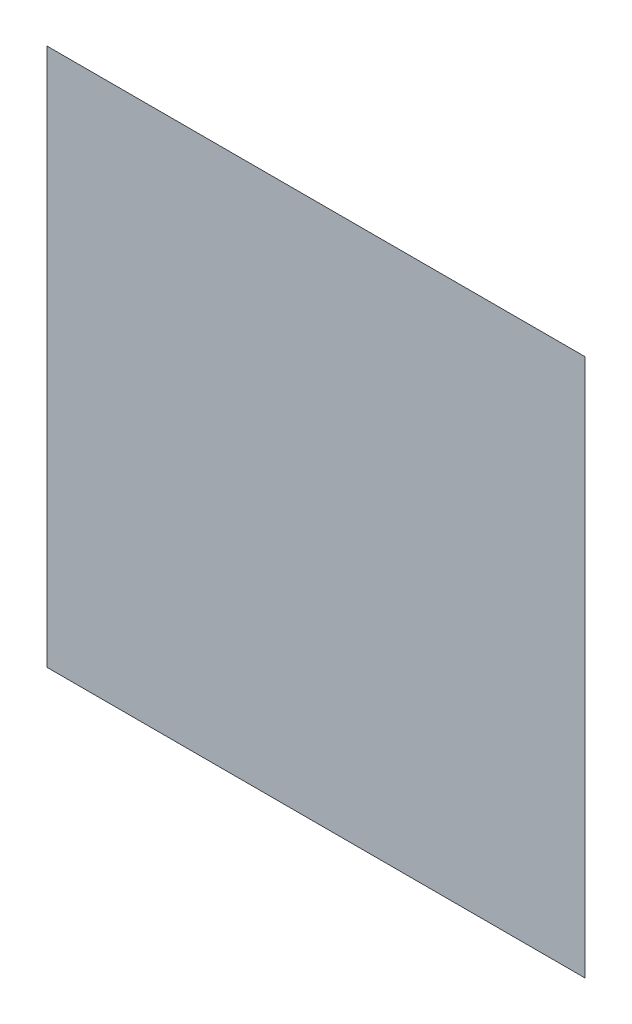
ISO-10303-21;
HEADER;
FILE_DESCRIPTION(('STEP AP214'),'2;1');
FILE_NAME('part.step','',(''),(''),'','','');
FILE_SCHEMA(('AUTOMOTIVE_DESIGN { 1 0 10303 214 1 1 1 1 }'));
ENDSEC;
DATA;
#1=APPLICATION_CONTEXT('core data for automotive mechanical design processes');
#2=APPLICATION_PROTOCOL_DEFINITION('international standard','automotive_design',2000,#1);
#3=PRODUCT_CONTEXT('',#1,'mechanical');
#4=PRODUCT('Part','Part','',(#3));
#5=PRODUCT_RELATED_PRODUCT_CATEGORY('part','',(#4));
#6=PRODUCT_DEFINITION_FORMATION('','',#4);
#7=PRODUCT_DEFINITION_CONTEXT('part definition',#1,'design');
#8=PRODUCT_DEFINITION('design','',#6,#7);
#9=PRODUCT_DEFINITION_SHAPE('','',#8);
#10=(LENGTH_UNIT() NAMED_UNIT(*) SI_UNIT(.MILLI.,.METRE.));
#11=(NAMED_UNIT(*) PLANE_ANGLE_UNIT() SI_UNIT($,.RADIAN.));
#12=(NAMED_UNIT(*) SI_UNIT($,.STERADIAN.) SOLID_ANGLE_UNIT());
#13=UNCERTAINTY_MEASURE_WITH_UNIT(LENGTH_MEASURE(1.E-05),#10,'distance_accuracy_value','');
#14=(GEOMETRIC_REPRESENTATION_CONTEXT(3) GLOBAL_UNCERTAINTY_ASSIGNED_CONTEXT((#13)) GLOBAL_UNIT_ASSIGNED_CONTEXT((#10,
#11,#12)) REPRESENTATION_CONTEXT('',''));
#15=CARTESIAN_POINT('',(0.,0.,0.));
#16=DIRECTION('',(0.,0.,1.));
#17=DIRECTION('',(1.,0.,0.));
#18=AXIS2_PLACEMENT_3D('',#15,#16,#17);
#19=CARTESIAN_POINT('',(41.48,49.94,1.1596000001));
#20=DIRECTION('',(0.,0.,1.));
#21=DIRECTION('',(1.,0.,0.));
#22=AXIS2_PLACEMENT_3D('',#19,#20,#21);
#23=PLANE('',#22);
#24=CARTESIAN_POINT('',(38.86,47.32,1.1596000001));
#25=DIRECTION('',(1.,0.,0.));
#26=VECTOR('',#25,1.);
#27=LINE('',#24,#26);
#28=CARTESIAN_POINT('',(38.86,47.32,1.1595500001));
#29=VERTEX_POINT('',#28);
#30=CARTESIAN_POINT('',(44.1,47.32,1.1595500001));
#31=VERTEX_POINT('',#30);
#32=EDGE_CURVE('E59',#29,#31,#27,.T.);
#33=ORIENTED_EDGE('',*,*,#32,.T.);
#34=CARTESIAN_POINT('',(44.1,47.32,1.1596000001));
#35=DIRECTION('',(0.,1.,0.));
#36=VECTOR('',#35,1.);
#37=LINE('',#34,#36);
#38=CARTESIAN_POINT('',(44.1,52.56,1.1595500001));
#39=VERTEX_POINT('',#38);
#40=EDGE_CURVE('E54',#31,#39,#37,.T.);
#41=ORIENTED_EDGE('',*,*,#40,.T.);
#42=CARTESIAN_POINT('',(44.1,52.56,1.1596000001));
#43=DIRECTION('',(-1.,0.,0.));
#44=VECTOR('',#43,1.);
#45=LINE('',#42,#44);
#46=CARTESIAN_POINT('',(38.86,52.56,1.1595500001));
#47=VERTEX_POINT('',#46);
#48=EDGE_CURVE('E11',#39,#47,#45,.T.);
#49=ORIENTED_EDGE('',*,*,#48,.T.);
#50=CARTESIAN_POINT('',(38.86,52.56,1.1596000001));
#51=DIRECTION('',(0.,-1.,0.));
#52=VECTOR('',#51,1.);
#53=LINE('',#50,#52);
#54=EDGE_CURVE('E29',#47,#29,#53,.T.);
#55=ORIENTED_EDGE('',*,*,#54,.T.);
#56=EDGE_LOOP('',(#33,#41,#49,#55));
#57=FACE_BOUND('',#56,.T.);
#58=ADVANCED_FACE('F17',(#57),#23,.T.);
#59=CARTESIAN_POINT('',(41.48,49.94,1.1595000001));
#60=DIRECTION('',(0.,0.,1.));
#61=DIRECTION('',(1.,0.,0.));
#62=AXIS2_PLACEMENT_3D('',#59,#60,#61);
#63=PLANE('',#62);
#64=ORIENTED_EDGE('',*,*,#40,.F.);
#65=ORIENTED_EDGE('',*,*,#32,.F.);
#66=ORIENTED_EDGE('',*,*,#54,.F.);
#67=ORIENTED_EDGE('',*,*,#48,.F.);
#68=EDGE_LOOP('',(#64,#65,#66,#67));
#69=FACE_BOUND('',#68,.T.);
#70=ADVANCED_FACE('F52',(#69),#63,.F.);
#71=CLOSED_SHELL('',(#58,#70));
#72=MANIFOLD_SOLID_BREP('B1',#71);
#73=ADVANCED_BREP_SHAPE_REPRESENTATION('',(#18,#72),#14);
#74=SHAPE_DEFINITION_REPRESENTATION(#9,#73);
ENDSEC;
END-ISO-10303-21;
